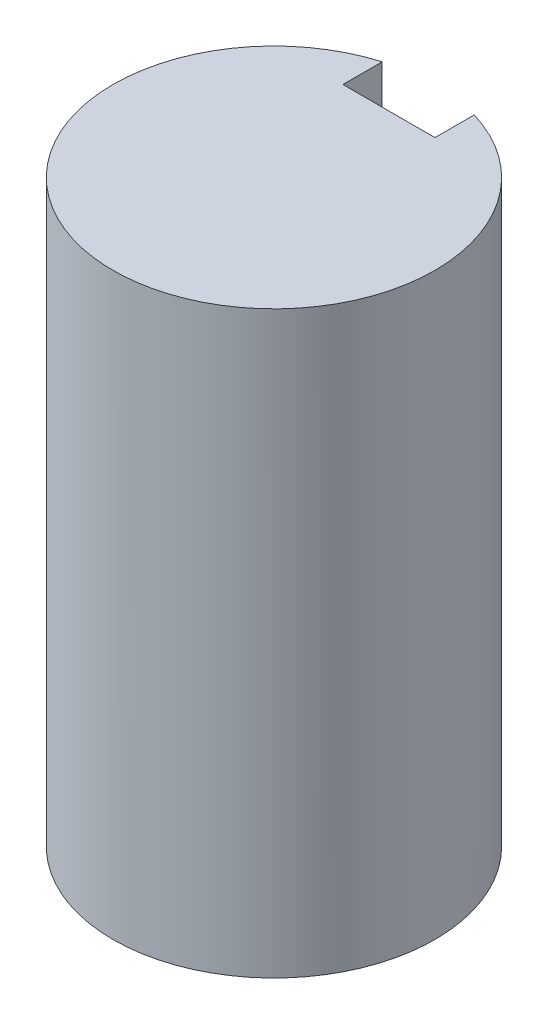
ISO-10303-21;
HEADER;
FILE_DESCRIPTION(('STEP AP214'),'2;1');
FILE_NAME('part.step','',(''),(''),'','','');
FILE_SCHEMA(('AUTOMOTIVE_DESIGN { 1 0 10303 214 1 1 1 1 }'));
ENDSEC;
DATA;
#1=APPLICATION_CONTEXT('core data for automotive mechanical design processes');
#2=APPLICATION_PROTOCOL_DEFINITION('international standard','automotive_design',2000,#1);
#3=PRODUCT_CONTEXT('',#1,'mechanical');
#4=PRODUCT('Part','Part','',(#3));
#5=PRODUCT_RELATED_PRODUCT_CATEGORY('part','',(#4));
#6=PRODUCT_DEFINITION_FORMATION('','',#4);
#7=PRODUCT_DEFINITION_CONTEXT('part definition',#1,'design');
#8=PRODUCT_DEFINITION('design','',#6,#7);
#9=PRODUCT_DEFINITION_SHAPE('','',#8);
#10=(LENGTH_UNIT() NAMED_UNIT(*) SI_UNIT(.MILLI.,.METRE.));
#11=(NAMED_UNIT(*) PLANE_ANGLE_UNIT() SI_UNIT($,.RADIAN.));
#12=(NAMED_UNIT(*) SI_UNIT($,.STERADIAN.) SOLID_ANGLE_UNIT());
#13=UNCERTAINTY_MEASURE_WITH_UNIT(LENGTH_MEASURE(1.E-05),#10,'distance_accuracy_value','');
#14=(GEOMETRIC_REPRESENTATION_CONTEXT(3) GLOBAL_UNCERTAINTY_ASSIGNED_CONTEXT((#13)) GLOBAL_UNIT_ASSIGNED_CONTEXT((#10,
#11,#12)) REPRESENTATION_CONTEXT('',''));
#15=CARTESIAN_POINT('',(0.,0.,0.));
#16=DIRECTION('',(0.,0.,1.));
#17=DIRECTION('',(1.,0.,0.));
#18=AXIS2_PLACEMENT_3D('',#15,#16,#17);
#19=CARTESIAN_POINT('',(0.,63.,0.));
#20=DIRECTION('',(0.,-1.,0.));
#21=DIRECTION('',(0.,0.,-1.));
#22=AXIS2_PLACEMENT_3D('',#19,#20,#21);
#23=CYLINDRICAL_SURFACE('',#22,17.5);
#24=CARTESIAN_POINT('',(0.,28.,0.));
#25=DIRECTION('',(0.,1.,0.));
#26=DIRECTION('',(0.,0.,1.));
#27=AXIS2_PLACEMENT_3D('',#24,#25,#26);
#28=CIRCLE('',#27,17.5);
#29=CARTESIAN_POINT('',(5.,28.,-16.7705098312484));
#30=VERTEX_POINT('',#29);
#31=CARTESIAN_POINT('',(-5.,28.,-16.7705098312484));
#32=VERTEX_POINT('',#31);
#33=EDGE_CURVE('E94',#30,#32,#28,.T.);
#34=ORIENTED_EDGE('',*,*,#33,.F.);
#35=DIRECTION('',(0.,1.,0.));
#36=VECTOR('',#35,1.);
#37=CARTESIAN_POINT('',(5.,28.,-16.7705098312484));
#38=LINE('',#37,#36);
#39=CARTESIAN_POINT('',(5.,63.,-16.7705098312484));
#40=VERTEX_POINT('',#39);
#41=EDGE_CURVE('E56',#30,#40,#38,.T.);
#42=ORIENTED_EDGE('',*,*,#41,.T.);
#43=CARTESIAN_POINT('',(0.,63.,0.));
#44=DIRECTION('',(0.,1.,0.));
#45=DIRECTION('',(0.,0.,1.));
#46=AXIS2_PLACEMENT_3D('',#43,#44,#45);
#47=CIRCLE('',#46,17.5);
#48=CARTESIAN_POINT('',(-5.,63.,-16.7705098312484));
#49=VERTEX_POINT('',#48);
#50=EDGE_CURVE('E11',#49,#40,#47,.T.);
#51=ORIENTED_EDGE('',*,*,#50,.F.);
#52=DIRECTION('',(0.,1.,0.));
#53=VECTOR('',#52,1.);
#54=CARTESIAN_POINT('',(-5.,28.,-16.7705098312484));
#55=LINE('',#54,#53);
#56=EDGE_CURVE('E47',#32,#49,#55,.T.);
#57=ORIENTED_EDGE('',*,*,#56,.F.);
#58=EDGE_LOOP('',(#34,#42,#51,#57));
#59=FACE_BOUND('',#58,.T.);
#60=CARTESIAN_POINT('',(0.,0.,0.));
#61=DIRECTION('',(0.,1.,0.));
#62=DIRECTION('',(0.,0.,1.));
#63=AXIS2_PLACEMENT_3D('',#60,#61,#62);
#64=CIRCLE('',#63,17.5);
#65=CARTESIAN_POINT('',(0.,0.,17.5));
#66=VERTEX_POINT('',#65);
#67=EDGE_CURVE('E36',#66,#66,#64,.T.);
#68=ORIENTED_EDGE('',*,*,#67,.T.);
#69=EDGE_LOOP('',(#68));
#70=FACE_BOUND('',#69,.T.);
#71=ADVANCED_FACE('F33',(#59,#70),#23,.T.);
#72=CARTESIAN_POINT('',(0.,63.,0.));
#73=DIRECTION('',(0.,1.,0.));
#74=DIRECTION('',(0.,0.,1.));
#75=AXIS2_PLACEMENT_3D('',#72,#73,#74);
#76=PLANE('',#75);
#77=DIRECTION('',(0.,0.,-1.));
#78=VECTOR('',#77,1.);
#79=CARTESIAN_POINT('',(5.,63.,-12.5));
#80=LINE('',#79,#78);
#81=CARTESIAN_POINT('',(5.,63.,-12.5));
#82=VERTEX_POINT('',#81);
#83=EDGE_CURVE('E71',#82,#40,#80,.T.);
#84=ORIENTED_EDGE('',*,*,#83,.F.);
#85=DIRECTION('',(1.,0.,0.));
#86=VECTOR('',#85,1.);
#87=CARTESIAN_POINT('',(-5.,63.,-12.5));
#88=LINE('',#87,#86);
#89=CARTESIAN_POINT('',(-5.,63.,-12.5));
#90=VERTEX_POINT('',#89);
#91=EDGE_CURVE('E100',#90,#82,#88,.T.);
#92=ORIENTED_EDGE('',*,*,#91,.F.);
#93=DIRECTION('',(0.,0.,1.));
#94=VECTOR('',#93,1.);
#95=CARTESIAN_POINT('',(-5.,63.,-12.5));
#96=LINE('',#95,#94);
#97=EDGE_CURVE('E80',#49,#90,#96,.T.);
#98=ORIENTED_EDGE('',*,*,#97,.F.);
#99=ORIENTED_EDGE('',*,*,#50,.T.);
#100=EDGE_LOOP('',(#84,#92,#98,#99));
#101=FACE_BOUND('',#100,.T.);
#102=ADVANCED_FACE('F107',(#101),#76,.T.);
#103=CARTESIAN_POINT('',(0.,0.,0.));
#104=DIRECTION('',(0.,1.,0.));
#105=DIRECTION('',(0.,0.,1.));
#106=AXIS2_PLACEMENT_3D('',#103,#104,#105);
#107=PLANE('',#106);
#108=ORIENTED_EDGE('',*,*,#67,.F.);
#109=EDGE_LOOP('',(#108));
#110=FACE_BOUND('',#109,.T.);
#111=ADVANCED_FACE('F115',(#110),#107,.F.);
#112=CARTESIAN_POINT('',(5.,28.,-12.5));
#113=DIRECTION('',(1.,0.,0.));
#114=DIRECTION('',(0.,0.,-1.));
#115=AXIS2_PLACEMENT_3D('',#112,#113,#114);
#116=PLANE('',#115);
#117=ORIENTED_EDGE('',*,*,#83,.T.);
#118=ORIENTED_EDGE('',*,*,#41,.F.);
#119=DIRECTION('',(0.,0.,-1.));
#120=VECTOR('',#119,1.);
#121=CARTESIAN_POINT('',(5.,28.,-12.5));
#122=LINE('',#121,#120);
#123=CARTESIAN_POINT('',(5.,28.,-12.5));
#124=VERTEX_POINT('',#123);
#125=EDGE_CURVE('E90',#124,#30,#122,.T.);
#126=ORIENTED_EDGE('',*,*,#125,.F.);
#127=DIRECTION('',(0.,1.,0.));
#128=VECTOR('',#127,1.);
#129=CARTESIAN_POINT('',(5.,28.,-12.5));
#130=LINE('',#129,#128);
#131=EDGE_CURVE('E84',#124,#82,#130,.T.);
#132=ORIENTED_EDGE('',*,*,#131,.T.);
#133=EDGE_LOOP('',(#117,#118,#126,#132));
#134=FACE_BOUND('',#133,.T.);
#135=ADVANCED_FACE('F105',(#134),#116,.F.);
#136=CARTESIAN_POINT('',(-5.,28.,-12.5));
#137=DIRECTION('',(0.,0.,1.));
#138=DIRECTION('',(1.,0.,0.));
#139=AXIS2_PLACEMENT_3D('',#136,#137,#138);
#140=PLANE('',#139);
#141=ORIENTED_EDGE('',*,*,#91,.T.);
#142=ORIENTED_EDGE('',*,*,#131,.F.);
#143=DIRECTION('',(1.,0.,0.));
#144=VECTOR('',#143,1.);
#145=CARTESIAN_POINT('',(-5.,28.,-12.5));
#146=LINE('',#145,#144);
#147=CARTESIAN_POINT('',(-5.,28.,-12.5));
#148=VERTEX_POINT('',#147);
#149=EDGE_CURVE('E87',#148,#124,#146,.T.);
#150=ORIENTED_EDGE('',*,*,#149,.F.);
#151=DIRECTION('',(0.,1.,0.));
#152=VECTOR('',#151,1.);
#153=CARTESIAN_POINT('',(-5.,28.,-12.5));
#154=LINE('',#153,#152);
#155=EDGE_CURVE('E77',#148,#90,#154,.T.);
#156=ORIENTED_EDGE('',*,*,#155,.T.);
#157=EDGE_LOOP('',(#141,#142,#150,#156));
#158=FACE_BOUND('',#157,.T.);
#159=ADVANCED_FACE('F88',(#158),#140,.F.);
#160=CARTESIAN_POINT('',(-5.,28.,-12.5));
#161=DIRECTION('',(-1.,0.,0.));
#162=DIRECTION('',(0.,0.,1.));
#163=AXIS2_PLACEMENT_3D('',#160,#161,#162);
#164=PLANE('',#163);
#165=ORIENTED_EDGE('',*,*,#97,.T.);
#166=ORIENTED_EDGE('',*,*,#155,.F.);
#167=DIRECTION('',(0.,0.,1.));
#168=VECTOR('',#167,1.);
#169=CARTESIAN_POINT('',(-5.,28.,-12.5));
#170=LINE('',#169,#168);
#171=EDGE_CURVE('E75',#32,#148,#170,.T.);
#172=ORIENTED_EDGE('',*,*,#171,.F.);
#173=ORIENTED_EDGE('',*,*,#56,.T.);
#174=EDGE_LOOP('',(#165,#166,#172,#173));
#175=FACE_BOUND('',#174,.T.);
#176=ADVANCED_FACE('F79',(#175),#164,.F.);
#177=CARTESIAN_POINT('',(0.,28.,0.));
#178=DIRECTION('',(0.,1.,0.));
#179=DIRECTION('',(0.,0.,1.));
#180=AXIS2_PLACEMENT_3D('',#177,#178,#179);
#181=PLANE('',#180);
#182=ORIENTED_EDGE('',*,*,#33,.T.);
#183=ORIENTED_EDGE('',*,*,#171,.T.);
#184=ORIENTED_EDGE('',*,*,#149,.T.);
#185=ORIENTED_EDGE('',*,*,#125,.T.);
#186=EDGE_LOOP('',(#182,#183,#184,#185));
#187=FACE_BOUND('',#186,.T.);
#188=ADVANCED_FACE('F92',(#187),#181,.T.);
#189=CLOSED_SHELL('',(#71,#102,#111,#135,#159,#176,#188));
#190=MANIFOLD_SOLID_BREP('B2',#189);
#191=ADVANCED_BREP_SHAPE_REPRESENTATION('',(#18,#190),#14);
#192=SHAPE_DEFINITION_REPRESENTATION(#9,#191);
ENDSEC;
END-ISO-10303-21;
